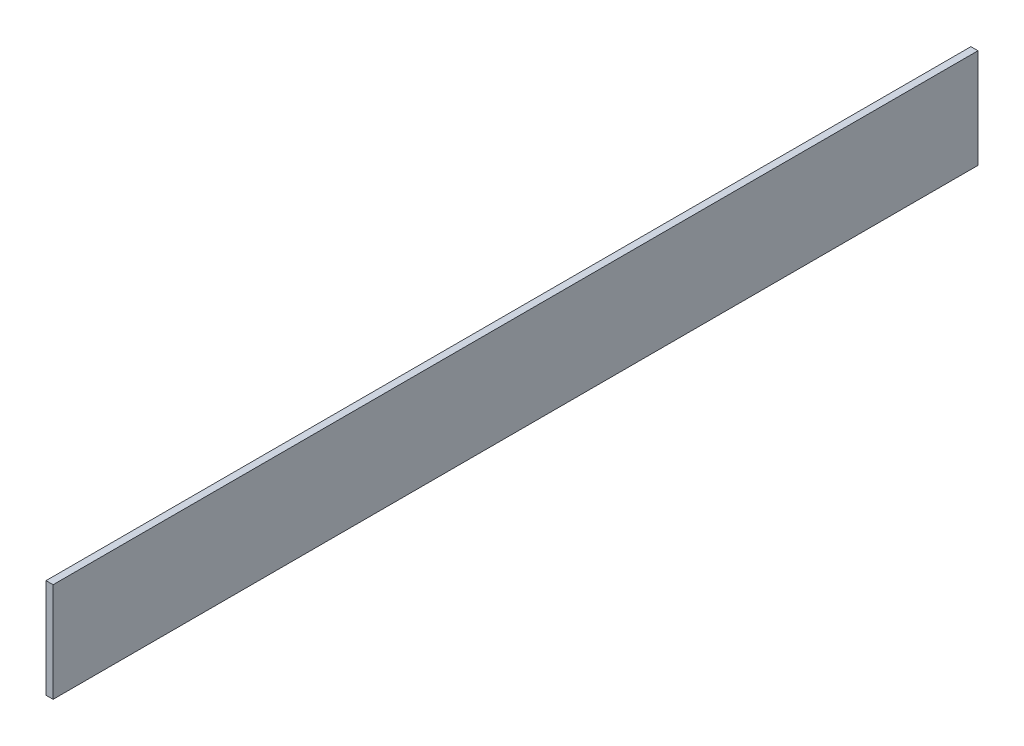
ISO-10303-21;
HEADER;
FILE_DESCRIPTION(('STEP AP214'),'2;1');
FILE_NAME('part.step','',(''),(''),'','','');
FILE_SCHEMA(('AUTOMOTIVE_DESIGN { 1 0 10303 214 1 1 1 1 }'));
ENDSEC;
DATA;
#1=APPLICATION_CONTEXT('core data for automotive mechanical design processes');
#2=APPLICATION_PROTOCOL_DEFINITION('international standard','automotive_design',2000,#1);
#3=PRODUCT_CONTEXT('',#1,'mechanical');
#4=PRODUCT('Part','Part','',(#3));
#5=PRODUCT_RELATED_PRODUCT_CATEGORY('part','',(#4));
#6=PRODUCT_DEFINITION_FORMATION('','',#4);
#7=PRODUCT_DEFINITION_CONTEXT('part definition',#1,'design');
#8=PRODUCT_DEFINITION('design','',#6,#7);
#9=PRODUCT_DEFINITION_SHAPE('','',#8);
#10=(LENGTH_UNIT() NAMED_UNIT(*) SI_UNIT(.MILLI.,.METRE.));
#11=(NAMED_UNIT(*) PLANE_ANGLE_UNIT() SI_UNIT($,.RADIAN.));
#12=(NAMED_UNIT(*) SI_UNIT($,.STERADIAN.) SOLID_ANGLE_UNIT());
#13=UNCERTAINTY_MEASURE_WITH_UNIT(LENGTH_MEASURE(1.E-05),#10,'distance_accuracy_value','');
#14=(GEOMETRIC_REPRESENTATION_CONTEXT(3) GLOBAL_UNCERTAINTY_ASSIGNED_CONTEXT((#13)) GLOBAL_UNIT_ASSIGNED_CONTEXT((#10,
#11,#12)) REPRESENTATION_CONTEXT('',''));
#15=CARTESIAN_POINT('',(0.,0.,0.));
#16=DIRECTION('',(0.,0.,1.));
#17=DIRECTION('',(1.,0.,0.));
#18=AXIS2_PLACEMENT_3D('',#15,#16,#17);
#19=CARTESIAN_POINT('',(0.,0.,0.));
#20=DIRECTION('',(1.,0.,0.));
#21=DIRECTION('',(0.,1.,0.));
#22=AXIS2_PLACEMENT_3D('',#19,#20,#21);
#23=PLANE('',#22);
#24=DIRECTION('',(0.,0.,-1.));
#25=VECTOR('',#24,1.);
#26=CARTESIAN_POINT('',(0.,-35.,326.));
#27=LINE('',#26,#25);
#28=CARTESIAN_POINT('',(0.,-35.,326.));
#29=VERTEX_POINT('',#28);
#30=CARTESIAN_POINT('',(0.,-35.,-326.));
#31=VERTEX_POINT('',#30);
#32=EDGE_CURVE('E27',#29,#31,#27,.T.);
#33=ORIENTED_EDGE('',*,*,#32,.F.);
#34=DIRECTION('',(0.,-1.,0.));
#35=VECTOR('',#34,1.);
#36=CARTESIAN_POINT('',(0.,35.,326.));
#37=LINE('',#36,#35);
#38=CARTESIAN_POINT('',(0.,35.,326.));
#39=VERTEX_POINT('',#38);
#40=EDGE_CURVE('E89',#39,#29,#37,.T.);
#41=ORIENTED_EDGE('',*,*,#40,.F.);
#42=DIRECTION('',(0.,0.,1.));
#43=VECTOR('',#42,1.);
#44=CARTESIAN_POINT('',(0.,35.,-326.));
#45=LINE('',#44,#43);
#46=CARTESIAN_POINT('',(0.,35.,-326.));
#47=VERTEX_POINT('',#46);
#48=EDGE_CURVE('E71',#47,#39,#45,.T.);
#49=ORIENTED_EDGE('',*,*,#48,.F.);
#50=DIRECTION('',(0.,1.,0.));
#51=VECTOR('',#50,1.);
#52=CARTESIAN_POINT('',(0.,-35.,-326.));
#53=LINE('',#52,#51);
#54=EDGE_CURVE('E112',#31,#47,#53,.T.);
#55=ORIENTED_EDGE('',*,*,#54,.F.);
#56=EDGE_LOOP('',(#33,#41,#49,#55));
#57=FACE_BOUND('',#56,.T.);
#58=ADVANCED_FACE('F17',(#57),#23,.F.);
#59=CARTESIAN_POINT('',(5.,0.,0.));
#60=DIRECTION('',(1.,0.,0.));
#61=DIRECTION('',(0.,1.,0.));
#62=AXIS2_PLACEMENT_3D('',#59,#60,#61);
#63=PLANE('',#62);
#64=DIRECTION('',(0.,0.,-1.));
#65=VECTOR('',#64,1.);
#66=CARTESIAN_POINT('',(5.,-35.,326.));
#67=LINE('',#66,#65);
#68=CARTESIAN_POINT('',(5.,-35.,326.));
#69=VERTEX_POINT('',#68);
#70=CARTESIAN_POINT('',(5.,-35.,-326.));
#71=VERTEX_POINT('',#70);
#72=EDGE_CURVE('E11',#69,#71,#67,.T.);
#73=ORIENTED_EDGE('',*,*,#72,.T.);
#74=DIRECTION('',(0.,1.,0.));
#75=VECTOR('',#74,1.);
#76=CARTESIAN_POINT('',(5.,-35.,-326.));
#77=LINE('',#76,#75);
#78=CARTESIAN_POINT('',(5.,35.,-326.));
#79=VERTEX_POINT('',#78);
#80=EDGE_CURVE('E114',#71,#79,#77,.T.);
#81=ORIENTED_EDGE('',*,*,#80,.T.);
#82=DIRECTION('',(0.,0.,1.));
#83=VECTOR('',#82,1.);
#84=CARTESIAN_POINT('',(5.,35.,-326.));
#85=LINE('',#84,#83);
#86=CARTESIAN_POINT('',(5.,35.,326.));
#87=VERTEX_POINT('',#86);
#88=EDGE_CURVE('E82',#79,#87,#85,.T.);
#89=ORIENTED_EDGE('',*,*,#88,.T.);
#90=DIRECTION('',(0.,-1.,0.));
#91=VECTOR('',#90,1.);
#92=CARTESIAN_POINT('',(5.,35.,326.));
#93=LINE('',#92,#91);
#94=EDGE_CURVE('E93',#87,#69,#93,.T.);
#95=ORIENTED_EDGE('',*,*,#94,.T.);
#96=EDGE_LOOP('',(#73,#81,#89,#95));
#97=FACE_BOUND('',#96,.T.);
#98=ADVANCED_FACE('F122',(#97),#63,.T.);
#99=CARTESIAN_POINT('',(0.,-35.,326.));
#100=DIRECTION('',(0.,-1.,0.));
#101=DIRECTION('',(0.,0.,-1.));
#102=AXIS2_PLACEMENT_3D('',#99,#100,#101);
#103=PLANE('',#102);
#104=ORIENTED_EDGE('',*,*,#32,.T.);
#105=DIRECTION('',(1.,0.,0.));
#106=VECTOR('',#105,1.);
#107=CARTESIAN_POINT('',(0.,-35.,-326.));
#108=LINE('',#107,#106);
#109=EDGE_CURVE('E20',#31,#71,#108,.T.);
#110=ORIENTED_EDGE('',*,*,#109,.T.);
#111=ORIENTED_EDGE('',*,*,#72,.F.);
#112=DIRECTION('',(1.,0.,0.));
#113=VECTOR('',#112,1.);
#114=CARTESIAN_POINT('',(0.,-35.,326.));
#115=LINE('',#114,#113);
#116=EDGE_CURVE('E92',#29,#69,#115,.T.);
#117=ORIENTED_EDGE('',*,*,#116,.F.);
#118=EDGE_LOOP('',(#104,#110,#111,#117));
#119=FACE_BOUND('',#118,.T.);
#120=ADVANCED_FACE('F121',(#119),#103,.T.);
#121=CARTESIAN_POINT('',(0.,-35.,-326.));
#122=DIRECTION('',(0.,0.,-1.));
#123=DIRECTION('',(0.,-1.,0.));
#124=AXIS2_PLACEMENT_3D('',#121,#122,#123);
#125=PLANE('',#124);
#126=ORIENTED_EDGE('',*,*,#54,.T.);
#127=DIRECTION('',(1.,0.,0.));
#128=VECTOR('',#127,1.);
#129=CARTESIAN_POINT('',(0.,35.,-326.));
#130=LINE('',#129,#128);
#131=EDGE_CURVE('E78',#47,#79,#130,.T.);
#132=ORIENTED_EDGE('',*,*,#131,.T.);
#133=ORIENTED_EDGE('',*,*,#80,.F.);
#134=ORIENTED_EDGE('',*,*,#109,.F.);
#135=EDGE_LOOP('',(#126,#132,#133,#134));
#136=FACE_BOUND('',#135,.T.);
#137=ADVANCED_FACE('F123',(#136),#125,.T.);
#138=CARTESIAN_POINT('',(0.,35.,-326.));
#139=DIRECTION('',(0.,1.,0.));
#140=DIRECTION('',(1.,0.,0.));
#141=AXIS2_PLACEMENT_3D('',#138,#139,#140);
#142=PLANE('',#141);
#143=ORIENTED_EDGE('',*,*,#48,.T.);
#144=DIRECTION('',(1.,0.,0.));
#145=VECTOR('',#144,1.);
#146=CARTESIAN_POINT('',(0.,35.,326.));
#147=LINE('',#146,#145);
#148=EDGE_CURVE('E76',#39,#87,#147,.T.);
#149=ORIENTED_EDGE('',*,*,#148,.T.);
#150=ORIENTED_EDGE('',*,*,#88,.F.);
#151=ORIENTED_EDGE('',*,*,#131,.F.);
#152=EDGE_LOOP('',(#143,#149,#150,#151));
#153=FACE_BOUND('',#152,.T.);
#154=ADVANCED_FACE('F72',(#153),#142,.T.);
#155=CARTESIAN_POINT('',(0.,35.,326.));
#156=DIRECTION('',(0.,0.,1.));
#157=DIRECTION('',(1.,0.,0.));
#158=AXIS2_PLACEMENT_3D('',#155,#156,#157);
#159=PLANE('',#158);
#160=ORIENTED_EDGE('',*,*,#40,.T.);
#161=ORIENTED_EDGE('',*,*,#116,.T.);
#162=ORIENTED_EDGE('',*,*,#94,.F.);
#163=ORIENTED_EDGE('',*,*,#148,.F.);
#164=EDGE_LOOP('',(#160,#161,#162,#163));
#165=FACE_BOUND('',#164,.T.);
#166=ADVANCED_FACE('F86',(#165),#159,.T.);
#167=CLOSED_SHELL('',(#58,#98,#120,#137,#154,#166));
#168=MANIFOLD_SOLID_BREP('B1',#167);
#169=ADVANCED_BREP_SHAPE_REPRESENTATION('',(#18,#168),#14);
#170=SHAPE_DEFINITION_REPRESENTATION(#9,#169);
ENDSEC;
END-ISO-10303-21;
